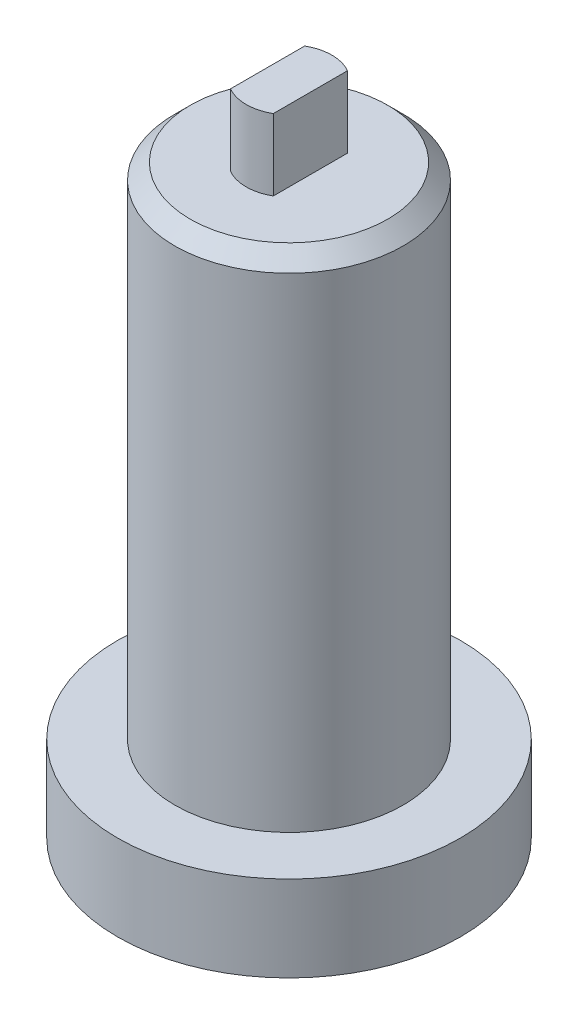
ISO-10303-21;
HEADER;
FILE_DESCRIPTION(('STEP AP214'),'2;1');
FILE_NAME('part.step','',(''),(''),'','','');
FILE_SCHEMA(('AUTOMOTIVE_DESIGN { 1 0 10303 214 1 1 1 1 }'));
ENDSEC;
DATA;
#1=APPLICATION_CONTEXT('core data for automotive mechanical design processes');
#2=APPLICATION_PROTOCOL_DEFINITION('international standard','automotive_design',2000,#1);
#3=PRODUCT_CONTEXT('',#1,'mechanical');
#4=PRODUCT('Part','Part','',(#3));
#5=PRODUCT_RELATED_PRODUCT_CATEGORY('part','',(#4));
#6=PRODUCT_DEFINITION_FORMATION('','',#4);
#7=PRODUCT_DEFINITION_CONTEXT('part definition',#1,'design');
#8=PRODUCT_DEFINITION('design','',#6,#7);
#9=PRODUCT_DEFINITION_SHAPE('','',#8);
#10=(LENGTH_UNIT() NAMED_UNIT(*) SI_UNIT(.MILLI.,.METRE.));
#11=(NAMED_UNIT(*) PLANE_ANGLE_UNIT() SI_UNIT($,.RADIAN.));
#12=(NAMED_UNIT(*) SI_UNIT($,.STERADIAN.) SOLID_ANGLE_UNIT());
#13=UNCERTAINTY_MEASURE_WITH_UNIT(LENGTH_MEASURE(1.E-05),#10,'distance_accuracy_value','');
#14=(GEOMETRIC_REPRESENTATION_CONTEXT(3) GLOBAL_UNCERTAINTY_ASSIGNED_CONTEXT((#13)) GLOBAL_UNIT_ASSIGNED_CONTEXT((#10,
#11,#12)) REPRESENTATION_CONTEXT('',''));
#15=CARTESIAN_POINT('',(0.,0.,0.));
#16=DIRECTION('',(0.,0.,1.));
#17=DIRECTION('',(1.,0.,0.));
#18=AXIS2_PLACEMENT_3D('',#15,#16,#17);
#19=CARTESIAN_POINT('',(0.,0.,0.));
#20=DIRECTION('',(0.,1.,0.));
#21=DIRECTION('',(0.,0.,1.));
#22=AXIS2_PLACEMENT_3D('',#19,#20,#21);
#23=CYLINDRICAL_SURFACE('',#22,3.);
#24=CARTESIAN_POINT('',(0.,41.,0.));
#25=DIRECTION('',(0.,1.,0.));
#26=DIRECTION('',(0.,0.,1.));
#27=AXIS2_PLACEMENT_3D('',#24,#25,#26);
#28=CIRCLE('',#27,3.);
#29=CARTESIAN_POINT('',(-1.5,41.,2.59807621135331));
#30=VERTEX_POINT('',#29);
#31=CARTESIAN_POINT('',(1.5,41.,2.59807621135331));
#32=VERTEX_POINT('',#31);
#33=EDGE_CURVE('E90',#30,#32,#28,.T.);
#34=ORIENTED_EDGE('',*,*,#33,.T.);
#35=DIRECTION('',(0.,1.,0.));
#36=VECTOR('',#35,1.);
#37=CARTESIAN_POINT('',(1.5,0.,2.59807621135332));
#38=LINE('',#37,#36);
#39=CARTESIAN_POINT('',(1.5,46.,2.59807621135332));
#40=VERTEX_POINT('',#39);
#41=EDGE_CURVE('E112',#32,#40,#38,.T.);
#42=ORIENTED_EDGE('',*,*,#41,.T.);
#43=CARTESIAN_POINT('',(0.,46.,0.));
#44=DIRECTION('',(0.,1.,0.));
#45=DIRECTION('',(0.,0.,1.));
#46=AXIS2_PLACEMENT_3D('',#43,#44,#45);
#47=CIRCLE('',#46,3.);
#48=CARTESIAN_POINT('',(-1.5,46.,2.59807621135331));
#49=VERTEX_POINT('',#48);
#50=EDGE_CURVE('E41',#49,#40,#47,.T.);
#51=ORIENTED_EDGE('',*,*,#50,.F.);
#52=DIRECTION('',(0.,1.,0.));
#53=VECTOR('',#52,1.);
#54=CARTESIAN_POINT('',(-1.5,0.,2.59807621135332));
#55=LINE('',#54,#53);
#56=EDGE_CURVE('E79',#49,#30,#55,.F.);
#57=ORIENTED_EDGE('',*,*,#56,.T.);
#58=EDGE_LOOP('',(#34,#42,#51,#57));
#59=FACE_BOUND('',#58,.T.);
#60=ADVANCED_FACE('F37',(#59),#23,.T.);
#61=CARTESIAN_POINT('',(0.,46.,0.));
#62=DIRECTION('',(0.,-1.,0.));
#63=DIRECTION('',(0.,0.,-1.));
#64=AXIS2_PLACEMENT_3D('',#61,#62,#63);
#65=PLANE('',#64);
#66=ORIENTED_EDGE('',*,*,#50,.T.);
#67=DIRECTION('',(0.,0.,1.));
#68=VECTOR('',#67,1.);
#69=CARTESIAN_POINT('',(1.5,46.,-16.));
#70=LINE('',#69,#68);
#71=CARTESIAN_POINT('',(1.5,46.,-2.59807621135332));
#72=VERTEX_POINT('',#71);
#73=EDGE_CURVE('E118',#72,#40,#70,.T.);
#74=ORIENTED_EDGE('',*,*,#73,.F.);
#75=CARTESIAN_POINT('',(-1.5,46.,-2.59807621135332));
#76=VERTEX_POINT('',#75);
#77=EDGE_CURVE('E11',#72,#76,#47,.T.);
#78=ORIENTED_EDGE('',*,*,#77,.T.);
#79=DIRECTION('',(0.,0.,1.));
#80=VECTOR('',#79,1.);
#81=CARTESIAN_POINT('',(-1.5,46.,-16.));
#82=LINE('',#81,#80);
#83=EDGE_CURVE('E84',#76,#49,#82,.T.);
#84=ORIENTED_EDGE('',*,*,#83,.T.);
#85=EDGE_LOOP('',(#66,#74,#78,#84));
#86=FACE_BOUND('',#85,.T.);
#87=ADVANCED_FACE('F39',(#86),#65,.F.);
#88=ORIENTED_EDGE('',*,*,#77,.F.);
#89=DIRECTION('',(0.,1.,0.));
#90=VECTOR('',#89,1.);
#91=CARTESIAN_POINT('',(1.5,0.,-2.59807621135332));
#92=LINE('',#91,#90);
#93=CARTESIAN_POINT('',(1.5,41.,-2.59807621135332));
#94=VERTEX_POINT('',#93);
#95=EDGE_CURVE('E114',#72,#94,#92,.F.);
#96=ORIENTED_EDGE('',*,*,#95,.T.);
#97=CARTESIAN_POINT('',(-1.5,41.,-2.59807621135332));
#98=VERTEX_POINT('',#97);
#99=EDGE_CURVE('E95',#94,#98,#28,.T.);
#100=ORIENTED_EDGE('',*,*,#99,.T.);
#101=DIRECTION('',(0.,1.,0.));
#102=VECTOR('',#101,1.);
#103=CARTESIAN_POINT('',(-1.5,0.,-2.59807621135332));
#104=LINE('',#103,#102);
#105=EDGE_CURVE('E82',#98,#76,#104,.T.);
#106=ORIENTED_EDGE('',*,*,#105,.T.);
#107=EDGE_LOOP('',(#88,#96,#100,#106));
#108=FACE_BOUND('',#107,.T.);
#109=ADVANCED_FACE('F125',(#108),#23,.T.);
#110=CARTESIAN_POINT('',(3.,41.,0.));
#111=DIRECTION('',(0.,-1.,0.));
#112=DIRECTION('',(0.,0.,-1.));
#113=AXIS2_PLACEMENT_3D('',#110,#111,#112);
#114=PLANE('',#113);
#115=ORIENTED_EDGE('',*,*,#33,.F.);
#116=DIRECTION('',(0.,0.,1.));
#117=VECTOR('',#116,1.);
#118=CARTESIAN_POINT('',(-1.5,41.,-16.));
#119=LINE('',#118,#117);
#120=EDGE_CURVE('E52',#98,#30,#119,.T.);
#121=ORIENTED_EDGE('',*,*,#120,.F.);
#122=ORIENTED_EDGE('',*,*,#99,.F.);
#123=DIRECTION('',(0.,0.,1.));
#124=VECTOR('',#123,1.);
#125=CARTESIAN_POINT('',(1.5,41.,-16.));
#126=LINE('',#125,#124);
#127=EDGE_CURVE('E60',#94,#32,#126,.T.);
#128=ORIENTED_EDGE('',*,*,#127,.T.);
#129=EDGE_LOOP('',(#115,#121,#122,#128));
#130=FACE_BOUND('',#129,.T.);
#131=CARTESIAN_POINT('',(0.,41.,0.));
#132=DIRECTION('',(0.,1.,0.));
#133=DIRECTION('',(0.,0.,1.));
#134=AXIS2_PLACEMENT_3D('',#131,#132,#133);
#135=CIRCLE('',#134,6.9175);
#136=CARTESIAN_POINT('',(0.,41.,6.9175));
#137=VERTEX_POINT('',#136);
#138=EDGE_CURVE('E96',#137,#137,#135,.T.);
#139=ORIENTED_EDGE('',*,*,#138,.T.);
#140=EDGE_LOOP('',(#139));
#141=FACE_BOUND('',#140,.T.);
#142=ADVANCED_FACE('F93',(#130,#141),#114,.F.);
#143=CARTESIAN_POINT('',(0.,39.9175,0.));
#144=DIRECTION('',(0.,-1.,0.));
#145=DIRECTION('',(0.,0.,-1.));
#146=AXIS2_PLACEMENT_3D('',#143,#144,#145);
#147=CONICAL_SURFACE('',#146,8.,0.785398163397448);
#148=ORIENTED_EDGE('',*,*,#138,.F.);
#149=EDGE_LOOP('',(#148));
#150=FACE_BOUND('',#149,.T.);
#151=CARTESIAN_POINT('',(0.,39.9175,0.));
#152=DIRECTION('',(0.,1.,0.));
#153=DIRECTION('',(0.,0.,1.));
#154=AXIS2_PLACEMENT_3D('',#151,#152,#153);
#155=CIRCLE('',#154,8.);
#156=CARTESIAN_POINT('',(0.,39.9175,8.));
#157=VERTEX_POINT('',#156);
#158=EDGE_CURVE('E98',#157,#157,#155,.T.);
#159=ORIENTED_EDGE('',*,*,#158,.T.);
#160=EDGE_LOOP('',(#159));
#161=FACE_BOUND('',#160,.T.);
#162=ADVANCED_FACE('F131',(#150,#161),#147,.T.);
#163=CARTESIAN_POINT('',(0.,0.,0.));
#164=DIRECTION('',(0.,1.,0.));
#165=DIRECTION('',(0.,0.,1.));
#166=AXIS2_PLACEMENT_3D('',#163,#164,#165);
#167=CYLINDRICAL_SURFACE('',#166,8.);
#168=ORIENTED_EDGE('',*,*,#158,.F.);
#169=EDGE_LOOP('',(#168));
#170=FACE_BOUND('',#169,.T.);
#171=CARTESIAN_POINT('',(0.,6.,0.));
#172=DIRECTION('',(0.,1.,0.));
#173=DIRECTION('',(0.,0.,1.));
#174=AXIS2_PLACEMENT_3D('',#171,#172,#173);
#175=CIRCLE('',#174,8.);
#176=CARTESIAN_POINT('',(0.,6.,8.));
#177=VERTEX_POINT('',#176);
#178=EDGE_CURVE('E103',#177,#177,#175,.T.);
#179=ORIENTED_EDGE('',*,*,#178,.T.);
#180=EDGE_LOOP('',(#179));
#181=FACE_BOUND('',#180,.T.);
#182=ADVANCED_FACE('F163',(#170,#181),#167,.T.);
#183=CARTESIAN_POINT('',(8.,6.,0.));
#184=DIRECTION('',(0.,-1.,0.));
#185=DIRECTION('',(0.,0.,-1.));
#186=AXIS2_PLACEMENT_3D('',#183,#184,#185);
#187=PLANE('',#186);
#188=ORIENTED_EDGE('',*,*,#178,.F.);
#189=EDGE_LOOP('',(#188));
#190=FACE_BOUND('',#189,.T.);
#191=CARTESIAN_POINT('',(0.,6.,0.));
#192=DIRECTION('',(0.,1.,0.));
#193=DIRECTION('',(0.,0.,1.));
#194=AXIS2_PLACEMENT_3D('',#191,#192,#193);
#195=CIRCLE('',#194,12.);
#196=CARTESIAN_POINT('',(0.,6.,12.));
#197=VERTEX_POINT('',#196);
#198=EDGE_CURVE('E106',#197,#197,#195,.T.);
#199=ORIENTED_EDGE('',*,*,#198,.T.);
#200=EDGE_LOOP('',(#199));
#201=FACE_BOUND('',#200,.T.);
#202=ADVANCED_FACE('F193',(#190,#201),#187,.F.);
#203=CARTESIAN_POINT('',(0.,0.,0.));
#204=DIRECTION('',(0.,1.,0.));
#205=DIRECTION('',(0.,0.,1.));
#206=AXIS2_PLACEMENT_3D('',#203,#204,#205);
#207=CYLINDRICAL_SURFACE('',#206,12.);
#208=ORIENTED_EDGE('',*,*,#198,.F.);
#209=EDGE_LOOP('',(#208));
#210=FACE_BOUND('',#209,.T.);
#211=CARTESIAN_POINT('',(0.,0.,0.));
#212=DIRECTION('',(0.,1.,0.));
#213=DIRECTION('',(0.,0.,1.));
#214=AXIS2_PLACEMENT_3D('',#211,#212,#213);
#215=CIRCLE('',#214,12.);
#216=CARTESIAN_POINT('',(0.,0.,12.));
#217=VERTEX_POINT('',#216);
#218=EDGE_CURVE('E109',#217,#217,#215,.T.);
#219=ORIENTED_EDGE('',*,*,#218,.T.);
#220=EDGE_LOOP('',(#219));
#221=FACE_BOUND('',#220,.T.);
#222=ADVANCED_FACE('F189',(#210,#221),#207,.T.);
#223=CARTESIAN_POINT('',(12.,0.,0.));
#224=DIRECTION('',(0.,1.,0.));
#225=DIRECTION('',(0.,0.,1.));
#226=AXIS2_PLACEMENT_3D('',#223,#224,#225);
#227=PLANE('',#226);
#228=ORIENTED_EDGE('',*,*,#218,.F.);
#229=EDGE_LOOP('',(#228));
#230=FACE_BOUND('',#229,.T.);
#231=ADVANCED_FACE('F174',(#230),#227,.F.);
#232=CARTESIAN_POINT('',(-1.5,41.,-16.));
#233=DIRECTION('',(1.,0.,0.));
#234=DIRECTION('',(0.,0.,-1.));
#235=AXIS2_PLACEMENT_3D('',#232,#233,#234);
#236=PLANE('',#235);
#237=ORIENTED_EDGE('',*,*,#120,.T.);
#238=ORIENTED_EDGE('',*,*,#56,.F.);
#239=ORIENTED_EDGE('',*,*,#83,.F.);
#240=ORIENTED_EDGE('',*,*,#105,.F.);
#241=EDGE_LOOP('',(#237,#238,#239,#240));
#242=FACE_BOUND('',#241,.T.);
#243=ADVANCED_FACE('F78',(#242),#236,.F.);
#244=CARTESIAN_POINT('',(1.5,46.,-16.));
#245=DIRECTION('',(-1.,0.,0.));
#246=DIRECTION('',(0.,0.,1.));
#247=AXIS2_PLACEMENT_3D('',#244,#245,#246);
#248=PLANE('',#247);
#249=ORIENTED_EDGE('',*,*,#127,.F.);
#250=ORIENTED_EDGE('',*,*,#95,.F.);
#251=ORIENTED_EDGE('',*,*,#73,.T.);
#252=ORIENTED_EDGE('',*,*,#41,.F.);
#253=EDGE_LOOP('',(#249,#250,#251,#252));
#254=FACE_BOUND('',#253,.T.);
#255=ADVANCED_FACE('F121',(#254),#248,.F.);
#256=CLOSED_SHELL('',(#60,#87,#109,#142,#162,#182,#202,#222,#231,#243,#255));
#257=MANIFOLD_SOLID_BREP('B2',#256);
#258=ADVANCED_BREP_SHAPE_REPRESENTATION('',(#18,#257),#14);
#259=SHAPE_DEFINITION_REPRESENTATION(#9,#258);
ENDSEC;
END-ISO-10303-21;
